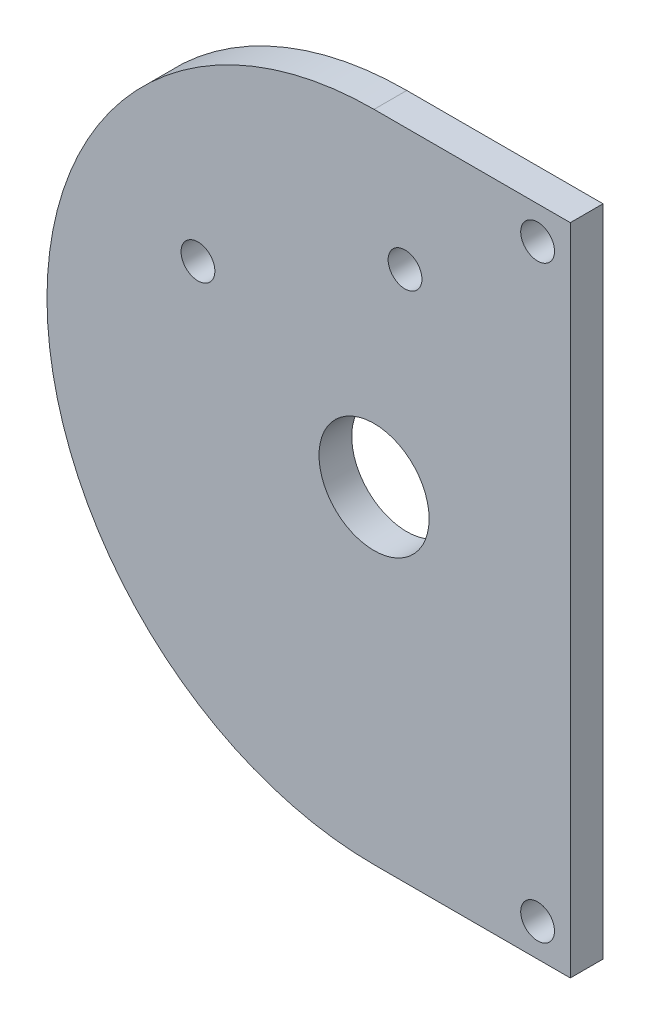
ISO-10303-21;
HEADER;
FILE_DESCRIPTION(('STEP AP214'),'2;1');
FILE_NAME('part.step','',(''),(''),'','','');
FILE_SCHEMA(('AUTOMOTIVE_DESIGN { 1 0 10303 214 1 1 1 1 }'));
ENDSEC;
DATA;
#1=APPLICATION_CONTEXT('core data for automotive mechanical design processes');
#2=APPLICATION_PROTOCOL_DEFINITION('international standard','automotive_design',2000,#1);
#3=PRODUCT_CONTEXT('',#1,'mechanical');
#4=PRODUCT('Part','Part','',(#3));
#5=PRODUCT_RELATED_PRODUCT_CATEGORY('part','',(#4));
#6=PRODUCT_DEFINITION_FORMATION('','',#4);
#7=PRODUCT_DEFINITION_CONTEXT('part definition',#1,'design');
#8=PRODUCT_DEFINITION('design','',#6,#7);
#9=PRODUCT_DEFINITION_SHAPE('','',#8);
#10=(LENGTH_UNIT() NAMED_UNIT(*) SI_UNIT(.MILLI.,.METRE.));
#11=(NAMED_UNIT(*) PLANE_ANGLE_UNIT() SI_UNIT($,.RADIAN.));
#12=(NAMED_UNIT(*) SI_UNIT($,.STERADIAN.) SOLID_ANGLE_UNIT());
#13=UNCERTAINTY_MEASURE_WITH_UNIT(LENGTH_MEASURE(1.E-05),#10,'distance_accuracy_value','');
#14=(GEOMETRIC_REPRESENTATION_CONTEXT(3) GLOBAL_UNCERTAINTY_ASSIGNED_CONTEXT((#13)) GLOBAL_UNIT_ASSIGNED_CONTEXT((#10,
#11,#12)) REPRESENTATION_CONTEXT('',''));
#15=CARTESIAN_POINT('',(0.,0.,0.));
#16=DIRECTION('',(0.,0.,1.));
#17=DIRECTION('',(1.,0.,0.));
#18=AXIS2_PLACEMENT_3D('',#15,#16,#17);
#19=CARTESIAN_POINT('',(0.,0.,3.));
#20=DIRECTION('',(0.,0.,1.));
#21=DIRECTION('',(1.,0.,0.));
#22=AXIS2_PLACEMENT_3D('',#19,#20,#21);
#23=PLANE('',#22);
#24=CARTESIAN_POINT('',(-16.1520774610924,9.84636480843916,3.));
#25=DIRECTION('',(0.,0.,1.));
#26=DIRECTION('',(1.,0.,0.));
#27=AXIS2_PLACEMENT_3D('',#24,#25,#26);
#28=CIRCLE('',#27,1.55);
#29=CARTESIAN_POINT('',(-14.6020774610925,9.84636480843916,3.));
#30=VERTEX_POINT('',#29);
#31=EDGE_CURVE('E126',#30,#30,#28,.T.);
#32=ORIENTED_EDGE('',*,*,#31,.F.);
#33=EDGE_LOOP('',(#32));
#34=FACE_BOUND('',#33,.T.);
#35=CARTESIAN_POINT('',(15.,27.,3.));
#36=DIRECTION('',(0.,0.,1.));
#37=DIRECTION('',(1.,0.,0.));
#38=AXIS2_PLACEMENT_3D('',#35,#36,#37);
#39=CIRCLE('',#38,1.55);
#40=CARTESIAN_POINT('',(16.55,27.,3.));
#41=VERTEX_POINT('',#40);
#42=EDGE_CURVE('E114',#41,#41,#39,.T.);
#43=ORIENTED_EDGE('',*,*,#42,.F.);
#44=EDGE_LOOP('',(#43));
#45=FACE_BOUND('',#44,.T.);
#46=CARTESIAN_POINT('',(0.,0.,3.));
#47=DIRECTION('',(0.,0.,1.));
#48=DIRECTION('',(1.,0.,0.));
#49=AXIS2_PLACEMENT_3D('',#46,#47,#48);
#50=CIRCLE('',#49,30.);
#51=CARTESIAN_POINT('',(0.,30.,3.));
#52=VERTEX_POINT('',#51);
#53=CARTESIAN_POINT('',(0.,-30.,3.));
#54=VERTEX_POINT('',#53);
#55=EDGE_CURVE('E84',#52,#54,#50,.T.);
#56=ORIENTED_EDGE('',*,*,#55,.T.);
#57=DIRECTION('',(1.,0.,0.));
#58=VECTOR('',#57,1.);
#59=CARTESIAN_POINT('',(0.,-30.,3.));
#60=LINE('',#59,#58);
#61=CARTESIAN_POINT('',(18.,-30.,3.));
#62=VERTEX_POINT('',#61);
#63=EDGE_CURVE('E79',#54,#62,#60,.T.);
#64=ORIENTED_EDGE('',*,*,#63,.T.);
#65=DIRECTION('',(0.,1.,0.));
#66=VECTOR('',#65,1.);
#67=CARTESIAN_POINT('',(18.,-30.,3.));
#68=LINE('',#67,#66);
#69=CARTESIAN_POINT('',(18.,30.,3.));
#70=VERTEX_POINT('',#69);
#71=EDGE_CURVE('E82',#62,#70,#68,.T.);
#72=ORIENTED_EDGE('',*,*,#71,.T.);
#73=DIRECTION('',(-1.,0.,0.));
#74=VECTOR('',#73,1.);
#75=CARTESIAN_POINT('',(18.,30.,3.));
#76=LINE('',#75,#74);
#77=EDGE_CURVE('E49',#70,#52,#76,.T.);
#78=ORIENTED_EDGE('',*,*,#77,.T.);
#79=EDGE_LOOP('',(#56,#64,#72,#78));
#80=FACE_BOUND('',#79,.T.);
#81=CARTESIAN_POINT('',(0.,0.,3.));
#82=DIRECTION('',(0.,0.,1.));
#83=DIRECTION('',(1.,0.,0.));
#84=AXIS2_PLACEMENT_3D('',#81,#82,#83);
#85=CIRCLE('',#84,5.05);
#86=CARTESIAN_POINT('',(5.05,0.,3.));
#87=VERTEX_POINT('',#86);
#88=EDGE_CURVE('E99',#87,#87,#85,.T.);
#89=ORIENTED_EDGE('',*,*,#88,.F.);
#90=EDGE_LOOP('',(#89));
#91=FACE_BOUND('',#90,.T.);
#92=CARTESIAN_POINT('',(15.,-27.,3.));
#93=DIRECTION('',(0.,0.,1.));
#94=DIRECTION('',(1.,0.,0.));
#95=AXIS2_PLACEMENT_3D('',#92,#93,#94);
#96=CIRCLE('',#95,1.55);
#97=CARTESIAN_POINT('',(16.55,-27.,3.));
#98=VERTEX_POINT('',#97);
#99=EDGE_CURVE('E120',#98,#98,#96,.T.);
#100=ORIENTED_EDGE('',*,*,#99,.F.);
#101=EDGE_LOOP('',(#100));
#102=FACE_BOUND('',#101,.T.);
#103=CARTESIAN_POINT('',(2.8396022162606,18.7023304832154,3.));
#104=DIRECTION('',(0.,0.,1.));
#105=DIRECTION('',(1.,0.,0.));
#106=AXIS2_PLACEMENT_3D('',#103,#104,#105);
#107=CIRCLE('',#106,1.55);
#108=CARTESIAN_POINT('',(4.3896022162606,18.7023304832154,3.));
#109=VERTEX_POINT('',#108);
#110=EDGE_CURVE('E132',#109,#109,#107,.T.);
#111=ORIENTED_EDGE('',*,*,#110,.F.);
#112=EDGE_LOOP('',(#111));
#113=FACE_BOUND('',#112,.T.);
#114=ADVANCED_FACE('F32',(#34,#45,#80,#91,#102,#113),#23,.T.);
#115=CARTESIAN_POINT('',(0.,0.,0.));
#116=DIRECTION('',(0.,0.,1.));
#117=DIRECTION('',(1.,0.,0.));
#118=AXIS2_PLACEMENT_3D('',#115,#116,#117);
#119=PLANE('',#118);
#120=CARTESIAN_POINT('',(0.,0.,0.));
#121=DIRECTION('',(0.,0.,1.));
#122=DIRECTION('',(1.,0.,0.));
#123=AXIS2_PLACEMENT_3D('',#120,#121,#122);
#124=CIRCLE('',#123,30.);
#125=CARTESIAN_POINT('',(0.,30.,0.));
#126=VERTEX_POINT('',#125);
#127=CARTESIAN_POINT('',(0.,-30.,0.));
#128=VERTEX_POINT('',#127);
#129=EDGE_CURVE('E96',#126,#128,#124,.T.);
#130=ORIENTED_EDGE('',*,*,#129,.F.);
#131=DIRECTION('',(-1.,0.,0.));
#132=VECTOR('',#131,1.);
#133=CARTESIAN_POINT('',(18.,30.,0.));
#134=LINE('',#133,#132);
#135=CARTESIAN_POINT('',(18.,30.,0.));
#136=VERTEX_POINT('',#135);
#137=EDGE_CURVE('E72',#136,#126,#134,.T.);
#138=ORIENTED_EDGE('',*,*,#137,.F.);
#139=DIRECTION('',(0.,1.,0.));
#140=VECTOR('',#139,1.);
#141=CARTESIAN_POINT('',(18.,-30.,0.));
#142=LINE('',#141,#140);
#143=CARTESIAN_POINT('',(18.,-30.,0.));
#144=VERTEX_POINT('',#143);
#145=EDGE_CURVE('E66',#144,#136,#142,.T.);
#146=ORIENTED_EDGE('',*,*,#145,.F.);
#147=DIRECTION('',(1.,0.,0.));
#148=VECTOR('',#147,1.);
#149=CARTESIAN_POINT('',(0.,-30.,0.));
#150=LINE('',#149,#148);
#151=EDGE_CURVE('E88',#128,#144,#150,.T.);
#152=ORIENTED_EDGE('',*,*,#151,.F.);
#153=EDGE_LOOP('',(#130,#138,#146,#152));
#154=FACE_BOUND('',#153,.T.);
#155=CARTESIAN_POINT('',(0.,0.,0.));
#156=DIRECTION('',(0.,0.,1.));
#157=DIRECTION('',(1.,0.,0.));
#158=AXIS2_PLACEMENT_3D('',#155,#156,#157);
#159=CIRCLE('',#158,5.05);
#160=CARTESIAN_POINT('',(5.05,0.,0.));
#161=VERTEX_POINT('',#160);
#162=EDGE_CURVE('E111',#161,#161,#159,.T.);
#163=ORIENTED_EDGE('',*,*,#162,.T.);
#164=EDGE_LOOP('',(#163));
#165=FACE_BOUND('',#164,.T.);
#166=CARTESIAN_POINT('',(15.,27.,0.));
#167=DIRECTION('',(0.,0.,1.));
#168=DIRECTION('',(1.,0.,0.));
#169=AXIS2_PLACEMENT_3D('',#166,#167,#168);
#170=CIRCLE('',#169,1.55);
#171=CARTESIAN_POINT('',(16.55,27.,0.));
#172=VERTEX_POINT('',#171);
#173=EDGE_CURVE('E117',#172,#172,#170,.T.);
#174=ORIENTED_EDGE('',*,*,#173,.T.);
#175=EDGE_LOOP('',(#174));
#176=FACE_BOUND('',#175,.T.);
#177=CARTESIAN_POINT('',(15.,-27.,0.));
#178=DIRECTION('',(0.,0.,1.));
#179=DIRECTION('',(1.,0.,0.));
#180=AXIS2_PLACEMENT_3D('',#177,#178,#179);
#181=CIRCLE('',#180,1.55);
#182=CARTESIAN_POINT('',(16.55,-27.,0.));
#183=VERTEX_POINT('',#182);
#184=EDGE_CURVE('E123',#183,#183,#181,.T.);
#185=ORIENTED_EDGE('',*,*,#184,.T.);
#186=EDGE_LOOP('',(#185));
#187=FACE_BOUND('',#186,.T.);
#188=CARTESIAN_POINT('',(-16.1520774610924,9.84636480843916,0.));
#189=DIRECTION('',(0.,0.,1.));
#190=DIRECTION('',(1.,0.,0.));
#191=AXIS2_PLACEMENT_3D('',#188,#189,#190);
#192=CIRCLE('',#191,1.55);
#193=CARTESIAN_POINT('',(-14.6020774610925,9.84636480843916,0.));
#194=VERTEX_POINT('',#193);
#195=EDGE_CURVE('E129',#194,#194,#192,.T.);
#196=ORIENTED_EDGE('',*,*,#195,.T.);
#197=EDGE_LOOP('',(#196));
#198=FACE_BOUND('',#197,.T.);
#199=CARTESIAN_POINT('',(2.8396022162606,18.7023304832154,0.));
#200=DIRECTION('',(0.,0.,1.));
#201=DIRECTION('',(1.,0.,0.));
#202=AXIS2_PLACEMENT_3D('',#199,#200,#201);
#203=CIRCLE('',#202,1.55);
#204=CARTESIAN_POINT('',(4.3896022162606,18.7023304832154,0.));
#205=VERTEX_POINT('',#204);
#206=EDGE_CURVE('E135',#205,#205,#203,.T.);
#207=ORIENTED_EDGE('',*,*,#206,.T.);
#208=EDGE_LOOP('',(#207));
#209=FACE_BOUND('',#208,.T.);
#210=ADVANCED_FACE('F107',(#154,#165,#176,#187,#198,#209),#119,.F.);
#211=CARTESIAN_POINT('',(0.,0.,3.));
#212=DIRECTION('',(0.,0.,-1.));
#213=DIRECTION('',(-1.,0.,0.));
#214=AXIS2_PLACEMENT_3D('',#211,#212,#213);
#215=CYLINDRICAL_SURFACE('',#214,30.);
#216=ORIENTED_EDGE('',*,*,#129,.T.);
#217=DIRECTION('',(0.,0.,-1.));
#218=VECTOR('',#217,1.);
#219=CARTESIAN_POINT('',(0.,-30.,3.));
#220=LINE('',#219,#218);
#221=EDGE_CURVE('E11',#54,#128,#220,.T.);
#222=ORIENTED_EDGE('',*,*,#221,.F.);
#223=ORIENTED_EDGE('',*,*,#55,.F.);
#224=DIRECTION('',(0.,0.,-1.));
#225=VECTOR('',#224,1.);
#226=CARTESIAN_POINT('',(0.,30.,3.));
#227=LINE('',#226,#225);
#228=EDGE_CURVE('E92',#52,#126,#227,.T.);
#229=ORIENTED_EDGE('',*,*,#228,.T.);
#230=EDGE_LOOP('',(#216,#222,#223,#229));
#231=FACE_BOUND('',#230,.T.);
#232=ADVANCED_FACE('F34',(#231),#215,.T.);
#233=CARTESIAN_POINT('',(0.,-30.,3.));
#234=DIRECTION('',(0.,1.,0.));
#235=DIRECTION('',(0.,0.,1.));
#236=AXIS2_PLACEMENT_3D('',#233,#234,#235);
#237=PLANE('',#236);
#238=ORIENTED_EDGE('',*,*,#151,.T.);
#239=DIRECTION('',(0.,0.,-1.));
#240=VECTOR('',#239,1.);
#241=CARTESIAN_POINT('',(18.,-30.,3.));
#242=LINE('',#241,#240);
#243=EDGE_CURVE('E41',#62,#144,#242,.T.);
#244=ORIENTED_EDGE('',*,*,#243,.F.);
#245=ORIENTED_EDGE('',*,*,#63,.F.);
#246=ORIENTED_EDGE('',*,*,#221,.T.);
#247=EDGE_LOOP('',(#238,#244,#245,#246));
#248=FACE_BOUND('',#247,.T.);
#249=ADVANCED_FACE('F87',(#248),#237,.F.);
#250=CARTESIAN_POINT('',(18.,-30.,3.));
#251=DIRECTION('',(-1.,0.,0.));
#252=DIRECTION('',(0.,0.,1.));
#253=AXIS2_PLACEMENT_3D('',#250,#251,#252);
#254=PLANE('',#253);
#255=ORIENTED_EDGE('',*,*,#145,.T.);
#256=DIRECTION('',(0.,0.,-1.));
#257=VECTOR('',#256,1.);
#258=CARTESIAN_POINT('',(18.,30.,3.));
#259=LINE('',#258,#257);
#260=EDGE_CURVE('E89',#70,#136,#259,.T.);
#261=ORIENTED_EDGE('',*,*,#260,.F.);
#262=ORIENTED_EDGE('',*,*,#71,.F.);
#263=ORIENTED_EDGE('',*,*,#243,.T.);
#264=EDGE_LOOP('',(#255,#261,#262,#263));
#265=FACE_BOUND('',#264,.T.);
#266=ADVANCED_FACE('F90',(#265),#254,.F.);
#267=CARTESIAN_POINT('',(18.,30.,3.));
#268=DIRECTION('',(0.,-1.,0.));
#269=DIRECTION('',(1.,0.,0.));
#270=AXIS2_PLACEMENT_3D('',#267,#268,#269);
#271=PLANE('',#270);
#272=ORIENTED_EDGE('',*,*,#137,.T.);
#273=ORIENTED_EDGE('',*,*,#228,.F.);
#274=ORIENTED_EDGE('',*,*,#77,.F.);
#275=ORIENTED_EDGE('',*,*,#260,.T.);
#276=EDGE_LOOP('',(#272,#273,#274,#275));
#277=FACE_BOUND('',#276,.T.);
#278=ADVANCED_FACE('F104',(#277),#271,.F.);
#279=CARTESIAN_POINT('',(0.,0.,3.));
#280=DIRECTION('',(0.,0.,-1.));
#281=DIRECTION('',(-1.,0.,0.));
#282=AXIS2_PLACEMENT_3D('',#279,#280,#281);
#283=CYLINDRICAL_SURFACE('',#282,5.05);
#284=ORIENTED_EDGE('',*,*,#88,.T.);
#285=EDGE_LOOP('',(#284));
#286=FACE_BOUND('',#285,.T.);
#287=ORIENTED_EDGE('',*,*,#162,.F.);
#288=EDGE_LOOP('',(#287));
#289=FACE_BOUND('',#288,.T.);
#290=ADVANCED_FACE('F154',(#286,#289),#283,.F.);
#291=CARTESIAN_POINT('',(15.,27.,3.));
#292=DIRECTION('',(0.,0.,-1.));
#293=DIRECTION('',(-1.,0.,0.));
#294=AXIS2_PLACEMENT_3D('',#291,#292,#293);
#295=CYLINDRICAL_SURFACE('',#294,1.55);
#296=ORIENTED_EDGE('',*,*,#42,.T.);
#297=EDGE_LOOP('',(#296));
#298=FACE_BOUND('',#297,.T.);
#299=ORIENTED_EDGE('',*,*,#173,.F.);
#300=EDGE_LOOP('',(#299));
#301=FACE_BOUND('',#300,.T.);
#302=ADVANCED_FACE('F200',(#298,#301),#295,.F.);
#303=CARTESIAN_POINT('',(15.,-27.,3.));
#304=DIRECTION('',(0.,0.,-1.));
#305=DIRECTION('',(-1.,0.,0.));
#306=AXIS2_PLACEMENT_3D('',#303,#304,#305);
#307=CYLINDRICAL_SURFACE('',#306,1.55);
#308=ORIENTED_EDGE('',*,*,#99,.T.);
#309=EDGE_LOOP('',(#308));
#310=FACE_BOUND('',#309,.T.);
#311=ORIENTED_EDGE('',*,*,#184,.F.);
#312=EDGE_LOOP('',(#311));
#313=FACE_BOUND('',#312,.T.);
#314=ADVANCED_FACE('F208',(#310,#313),#307,.F.);
#315=CARTESIAN_POINT('',(-16.1520774610924,9.84636480843916,3.));
#316=DIRECTION('',(0.,0.,-1.));
#317=DIRECTION('',(-1.,0.,0.));
#318=AXIS2_PLACEMENT_3D('',#315,#316,#317);
#319=CYLINDRICAL_SURFACE('',#318,1.55);
#320=ORIENTED_EDGE('',*,*,#31,.T.);
#321=EDGE_LOOP('',(#320));
#322=FACE_BOUND('',#321,.T.);
#323=ORIENTED_EDGE('',*,*,#195,.F.);
#324=EDGE_LOOP('',(#323));
#325=FACE_BOUND('',#324,.T.);
#326=ADVANCED_FACE('F216',(#322,#325),#319,.F.);
#327=CARTESIAN_POINT('',(2.8396022162606,18.7023304832154,3.));
#328=DIRECTION('',(0.,0.,-1.));
#329=DIRECTION('',(-1.,0.,0.));
#330=AXIS2_PLACEMENT_3D('',#327,#328,#329);
#331=CYLINDRICAL_SURFACE('',#330,1.55);
#332=ORIENTED_EDGE('',*,*,#110,.T.);
#333=EDGE_LOOP('',(#332));
#334=FACE_BOUND('',#333,.T.);
#335=ORIENTED_EDGE('',*,*,#206,.F.);
#336=EDGE_LOOP('',(#335));
#337=FACE_BOUND('',#336,.T.);
#338=ADVANCED_FACE('F141',(#334,#337),#331,.F.);
#339=CLOSED_SHELL('',(#114,#210,#232,#249,#266,#278,#290,#302,#314,#326,#338));
#340=MANIFOLD_SOLID_BREP('B2',#339);
#341=ADVANCED_BREP_SHAPE_REPRESENTATION('',(#18,#340),#14);
#342=SHAPE_DEFINITION_REPRESENTATION(#9,#341);
ENDSEC;
END-ISO-10303-21;
